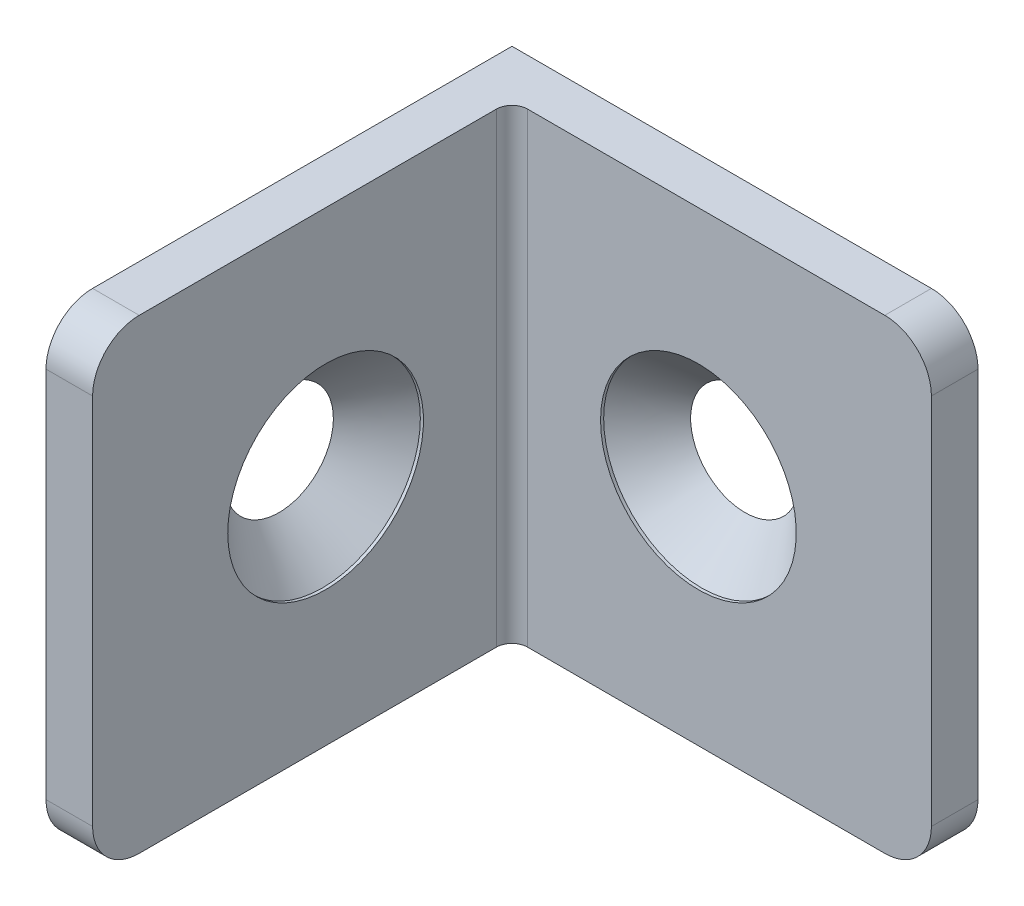
ISO-10303-21;
HEADER;
FILE_DESCRIPTION(('STEP AP214'),'2;1');
FILE_NAME('part.step','',(''),(''),'','','');
FILE_SCHEMA(('AUTOMOTIVE_DESIGN { 1 0 10303 214 1 1 1 1 }'));
ENDSEC;
DATA;
#1=APPLICATION_CONTEXT('core data for automotive mechanical design processes');
#2=APPLICATION_PROTOCOL_DEFINITION('international standard','automotive_design',2000,#1);
#3=PRODUCT_CONTEXT('',#1,'mechanical');
#4=PRODUCT('Part','Part','',(#3));
#5=PRODUCT_RELATED_PRODUCT_CATEGORY('part','',(#4));
#6=PRODUCT_DEFINITION_FORMATION('','',#4);
#7=PRODUCT_DEFINITION_CONTEXT('part definition',#1,'design');
#8=PRODUCT_DEFINITION('design','',#6,#7);
#9=PRODUCT_DEFINITION_SHAPE('','',#8);
#10=(LENGTH_UNIT() NAMED_UNIT(*) SI_UNIT(.MILLI.,.METRE.));
#11=(NAMED_UNIT(*) PLANE_ANGLE_UNIT() SI_UNIT($,.RADIAN.));
#12=(NAMED_UNIT(*) SI_UNIT($,.STERADIAN.) SOLID_ANGLE_UNIT());
#13=UNCERTAINTY_MEASURE_WITH_UNIT(LENGTH_MEASURE(1.E-05),#10,'distance_accuracy_value','');
#14=(GEOMETRIC_REPRESENTATION_CONTEXT(3) GLOBAL_UNCERTAINTY_ASSIGNED_CONTEXT((#13)) GLOBAL_UNIT_ASSIGNED_CONTEXT((#10,
#11,#12)) REPRESENTATION_CONTEXT('',''));
#15=CARTESIAN_POINT('',(0.,0.,0.));
#16=DIRECTION('',(0.,0.,1.));
#17=DIRECTION('',(1.,0.,0.));
#18=AXIS2_PLACEMENT_3D('',#15,#16,#17);
#19=CARTESIAN_POINT('',(0.,0.,2.9));
#20=DIRECTION('',(0.,0.,-1.));
#21=DIRECTION('',(-1.,0.,0.));
#22=AXIS2_PLACEMENT_3D('',#19,#20,#21);
#23=CYLINDRICAL_SURFACE('',#22,6.3);
#24=CARTESIAN_POINT('',(0.,0.,3.));
#25=DIRECTION('',(0.,0.,-1.));
#26=DIRECTION('',(-1.,0.,0.));
#27=AXIS2_PLACEMENT_3D('',#24,#25,#26);
#28=CIRCLE('',#27,6.3);
#29=CARTESIAN_POINT('',(-6.3,0.,3.));
#30=VERTEX_POINT('',#29);
#31=EDGE_CURVE('E140',#30,#30,#28,.T.);
#32=ORIENTED_EDGE('',*,*,#31,.F.);
#33=EDGE_LOOP('',(#32));
#34=FACE_BOUND('',#33,.T.);
#35=CARTESIAN_POINT('',(0.,0.,2.79999999997926));
#36=DIRECTION('',(0.,0.,1.));
#37=DIRECTION('',(1.,0.,0.));
#38=AXIS2_PLACEMENT_3D('',#35,#36,#37);
#39=CIRCLE('',#38,6.30000000006703);
#40=CARTESIAN_POINT('',(6.30000000006703,0.,2.79999999997926));
#41=VERTEX_POINT('',#40);
#42=EDGE_CURVE('E146',#41,#41,#39,.F.);
#43=ORIENTED_EDGE('',*,*,#42,.T.);
#44=EDGE_LOOP('',(#43));
#45=FACE_BOUND('',#44,.T.);
#46=ADVANCED_FACE('F16',(#34,#45),#23,.F.);
#47=CARTESIAN_POINT('',(-11.,-15.,4.));
#48=DIRECTION('',(0.,-1.,0.));
#49=DIRECTION('',(0.,0.,-1.));
#50=AXIS2_PLACEMENT_3D('',#47,#48,#49);
#51=CYLINDRICAL_SURFACE('',#50,1.);
#52=DIRECTION('',(0.,1.,0.));
#53=VECTOR('',#52,1.);
#54=CARTESIAN_POINT('',(-12.,0.,4.));
#55=LINE('',#54,#53);
#56=CARTESIAN_POINT('',(-12.,15.,4.));
#57=VERTEX_POINT('',#56);
#58=CARTESIAN_POINT('',(-12.,-15.,4.));
#59=VERTEX_POINT('',#58);
#60=EDGE_CURVE('E106',#57,#59,#55,.F.);
#61=ORIENTED_EDGE('',*,*,#60,.T.);
#62=CARTESIAN_POINT('',(-11.,-15.,4.));
#63=DIRECTION('',(0.,-1.,0.));
#64=DIRECTION('',(0.,0.,-1.));
#65=AXIS2_PLACEMENT_3D('',#62,#63,#64);
#66=CIRCLE('',#65,1.);
#67=CARTESIAN_POINT('',(-11.,-15.,3.));
#68=VERTEX_POINT('',#67);
#69=EDGE_CURVE('E19',#68,#59,#66,.F.);
#70=ORIENTED_EDGE('',*,*,#69,.F.);
#71=DIRECTION('',(0.,1.,0.));
#72=VECTOR('',#71,1.);
#73=CARTESIAN_POINT('',(-11.,0.,3.));
#74=LINE('',#73,#72);
#75=CARTESIAN_POINT('',(-11.,15.,3.));
#76=VERTEX_POINT('',#75);
#77=EDGE_CURVE('E139',#76,#68,#74,.F.);
#78=ORIENTED_EDGE('',*,*,#77,.F.);
#79=CARTESIAN_POINT('',(-11.,15.,4.));
#80=DIRECTION('',(0.,-1.,0.));
#81=DIRECTION('',(0.,0.,-1.));
#82=AXIS2_PLACEMENT_3D('',#79,#80,#81);
#83=CIRCLE('',#82,1.);
#84=EDGE_CURVE('E104',#57,#76,#83,.T.);
#85=ORIENTED_EDGE('',*,*,#84,.F.);
#86=EDGE_LOOP('',(#61,#70,#78,#85));
#87=FACE_BOUND('',#86,.T.);
#88=ADVANCED_FACE('F107',(#87),#51,.F.);
#89=CARTESIAN_POINT('',(-12.1,0.,15.));
#90=DIRECTION('',(-1.,0.,0.));
#91=DIRECTION('',(0.,0.,1.));
#92=AXIS2_PLACEMENT_3D('',#89,#90,#91);
#93=CYLINDRICAL_SURFACE('',#92,6.3);
#94=CARTESIAN_POINT('',(-12.,0.,15.));
#95=DIRECTION('',(-1.,0.,0.));
#96=DIRECTION('',(0.,0.,1.));
#97=AXIS2_PLACEMENT_3D('',#94,#95,#96);
#98=CIRCLE('',#97,6.3);
#99=CARTESIAN_POINT('',(-12.,0.,21.3));
#100=VERTEX_POINT('',#99);
#101=EDGE_CURVE('E112',#100,#100,#98,.F.);
#102=ORIENTED_EDGE('',*,*,#101,.T.);
#103=EDGE_LOOP('',(#102));
#104=FACE_BOUND('',#103,.T.);
#105=CARTESIAN_POINT('',(-12.1999999999503,0.,15.));
#106=DIRECTION('',(1.,0.,0.));
#107=DIRECTION('',(0.,0.,-1.));
#108=AXIS2_PLACEMENT_3D('',#105,#106,#107);
#109=CIRCLE('',#108,6.30000000002383);
#110=CARTESIAN_POINT('',(-12.1999999999503,0.,8.69999999997617));
#111=VERTEX_POINT('',#110);
#112=EDGE_CURVE('E111',#111,#111,#109,.F.);
#113=ORIENTED_EDGE('',*,*,#112,.T.);
#114=EDGE_LOOP('',(#113));
#115=FACE_BOUND('',#114,.T.);
#116=ADVANCED_FACE('F359',(#104,#115),#93,.F.);
#117=CARTESIAN_POINT('',(0.,0.,2.79999999997926));
#118=DIRECTION('',(0.,0.,1.));
#119=DIRECTION('',(1.,0.,0.));
#120=AXIS2_PLACEMENT_3D('',#117,#118,#119);
#121=CONICAL_SURFACE('',#120,6.30000000006703,0.785398163407599);
#122=ORIENTED_EDGE('',*,*,#42,.F.);
#123=EDGE_LOOP('',(#122));
#124=FACE_BOUND('',#123,.T.);
#125=CARTESIAN_POINT('',(0.,0.,0.));
#126=DIRECTION('',(0.,0.,1.));
#127=DIRECTION('',(1.,0.,0.));
#128=AXIS2_PLACEMENT_3D('',#125,#126,#127);
#129=CIRCLE('',#128,3.50000000003092);
#130=CARTESIAN_POINT('',(3.50000000003092,0.,0.));
#131=VERTEX_POINT('',#130);
#132=EDGE_CURVE('E121',#131,#131,#129,.F.);
#133=ORIENTED_EDGE('',*,*,#132,.T.);
#134=EDGE_LOOP('',(#133));
#135=FACE_BOUND('',#134,.T.);
#136=ADVANCED_FACE('F349',(#124,#135),#121,.F.);
#137=CARTESIAN_POINT('',(12.,-12.,3.));
#138=DIRECTION('',(0.,0.,1.));
#139=DIRECTION('',(1.,0.,0.));
#140=AXIS2_PLACEMENT_3D('',#137,#138,#139);
#141=CYLINDRICAL_SURFACE('',#140,3.);
#142=CARTESIAN_POINT('',(12.,-12.,3.));
#143=DIRECTION('',(0.,0.,1.));
#144=DIRECTION('',(1.,0.,0.));
#145=AXIS2_PLACEMENT_3D('',#142,#143,#144);
#146=CIRCLE('',#145,3.);
#147=CARTESIAN_POINT('',(12.,-15.,3.));
#148=VERTEX_POINT('',#147);
#149=CARTESIAN_POINT('',(15.,-12.,3.));
#150=VERTEX_POINT('',#149);
#151=EDGE_CURVE('E133',#148,#150,#146,.T.);
#152=ORIENTED_EDGE('',*,*,#151,.F.);
#153=DIRECTION('',(0.,0.,1.));
#154=VECTOR('',#153,1.);
#155=CARTESIAN_POINT('',(12.,-15.,15.));
#156=LINE('',#155,#154);
#157=CARTESIAN_POINT('',(12.,-15.,0.));
#158=VERTEX_POINT('',#157);
#159=EDGE_CURVE('E119',#148,#158,#156,.F.);
#160=ORIENTED_EDGE('',*,*,#159,.T.);
#161=CARTESIAN_POINT('',(12.,-12.,0.));
#162=DIRECTION('',(0.,0.,1.));
#163=DIRECTION('',(1.,0.,0.));
#164=AXIS2_PLACEMENT_3D('',#161,#162,#163);
#165=CIRCLE('',#164,3.);
#166=CARTESIAN_POINT('',(15.,-12.,0.));
#167=VERTEX_POINT('',#166);
#168=EDGE_CURVE('E168',#158,#167,#165,.T.);
#169=ORIENTED_EDGE('',*,*,#168,.T.);
#170=DIRECTION('',(0.,0.,1.));
#171=VECTOR('',#170,1.);
#172=CARTESIAN_POINT('',(15.,-12.,1.5));
#173=LINE('',#172,#171);
#174=EDGE_CURVE('E144',#167,#150,#173,.T.);
#175=ORIENTED_EDGE('',*,*,#174,.T.);
#176=EDGE_LOOP('',(#152,#160,#169,#175));
#177=FACE_BOUND('',#176,.T.);
#178=ADVANCED_FACE('F339',(#177),#141,.T.);
#179=CARTESIAN_POINT('',(15.,0.,1.5));
#180=DIRECTION('',(-1.,0.,0.));
#181=DIRECTION('',(0.,0.,1.));
#182=AXIS2_PLACEMENT_3D('',#179,#180,#181);
#183=PLANE('',#182);
#184=DIRECTION('',(0.,1.,0.));
#185=VECTOR('',#184,1.);
#186=CARTESIAN_POINT('',(15.,0.,3.));
#187=LINE('',#186,#185);
#188=CARTESIAN_POINT('',(15.,12.,3.));
#189=VERTEX_POINT('',#188);
#190=EDGE_CURVE('E130',#150,#189,#187,.T.);
#191=ORIENTED_EDGE('',*,*,#190,.F.);
#192=ORIENTED_EDGE('',*,*,#174,.F.);
#193=DIRECTION('',(0.,1.,0.));
#194=VECTOR('',#193,1.);
#195=CARTESIAN_POINT('',(15.,0.,0.));
#196=LINE('',#195,#194);
#197=CARTESIAN_POINT('',(15.,12.,0.));
#198=VERTEX_POINT('',#197);
#199=EDGE_CURVE('E167',#167,#198,#196,.T.);
#200=ORIENTED_EDGE('',*,*,#199,.T.);
#201=DIRECTION('',(0.,0.,-1.));
#202=VECTOR('',#201,1.);
#203=CARTESIAN_POINT('',(15.,12.,0.));
#204=LINE('',#203,#202);
#205=EDGE_CURVE('E142',#189,#198,#204,.T.);
#206=ORIENTED_EDGE('',*,*,#205,.F.);
#207=EDGE_LOOP('',(#191,#192,#200,#206));
#208=FACE_BOUND('',#207,.T.);
#209=ADVANCED_FACE('F329',(#208),#183,.F.);
#210=CARTESIAN_POINT('',(12.,12.,0.));
#211=DIRECTION('',(0.,0.,-1.));
#212=DIRECTION('',(-1.,0.,0.));
#213=AXIS2_PLACEMENT_3D('',#210,#211,#212);
#214=CYLINDRICAL_SURFACE('',#213,3.);
#215=CARTESIAN_POINT('',(12.,12.,0.));
#216=DIRECTION('',(0.,0.,-1.));
#217=DIRECTION('',(-1.,0.,0.));
#218=AXIS2_PLACEMENT_3D('',#215,#216,#217);
#219=CIRCLE('',#218,3.);
#220=CARTESIAN_POINT('',(12.,15.,0.));
#221=VERTEX_POINT('',#220);
#222=EDGE_CURVE('E164',#198,#221,#219,.F.);
#223=ORIENTED_EDGE('',*,*,#222,.T.);
#224=DIRECTION('',(0.,0.,-1.));
#225=VECTOR('',#224,1.);
#226=CARTESIAN_POINT('',(12.,15.,15.));
#227=LINE('',#226,#225);
#228=CARTESIAN_POINT('',(12.,15.,3.));
#229=VERTEX_POINT('',#228);
#230=EDGE_CURVE('E134',#221,#229,#227,.F.);
#231=ORIENTED_EDGE('',*,*,#230,.T.);
#232=CARTESIAN_POINT('',(12.,12.,3.));
#233=DIRECTION('',(0.,0.,-1.));
#234=DIRECTION('',(-1.,0.,0.));
#235=AXIS2_PLACEMENT_3D('',#232,#233,#234);
#236=CIRCLE('',#235,3.);
#237=EDGE_CURVE('E132',#189,#229,#236,.F.);
#238=ORIENTED_EDGE('',*,*,#237,.F.);
#239=ORIENTED_EDGE('',*,*,#205,.T.);
#240=EDGE_LOOP('',(#223,#231,#238,#239));
#241=FACE_BOUND('',#240,.T.);
#242=ADVANCED_FACE('F320',(#241),#214,.T.);
#243=CARTESIAN_POINT('',(0.,0.,3.));
#244=DIRECTION('',(0.,0.,1.));
#245=DIRECTION('',(1.,0.,0.));
#246=AXIS2_PLACEMENT_3D('',#243,#244,#245);
#247=PLANE('',#246);
#248=ORIENTED_EDGE('',*,*,#237,.T.);
#249=DIRECTION('',(1.,0.,0.));
#250=VECTOR('',#249,1.);
#251=CARTESIAN_POINT('',(-13.5,15.,3.));
#252=LINE('',#251,#250);
#253=EDGE_CURVE('E137',#229,#76,#252,.F.);
#254=ORIENTED_EDGE('',*,*,#253,.T.);
#255=ORIENTED_EDGE('',*,*,#77,.T.);
#256=DIRECTION('',(1.,0.,0.));
#257=VECTOR('',#256,1.);
#258=CARTESIAN_POINT('',(-13.5,-15.,3.));
#259=LINE('',#258,#257);
#260=EDGE_CURVE('E103',#68,#148,#259,.T.);
#261=ORIENTED_EDGE('',*,*,#260,.T.);
#262=ORIENTED_EDGE('',*,*,#151,.T.);
#263=ORIENTED_EDGE('',*,*,#190,.T.);
#264=EDGE_LOOP('',(#248,#254,#255,#261,#262,#263));
#265=FACE_BOUND('',#264,.T.);
#266=ORIENTED_EDGE('',*,*,#31,.T.);
#267=EDGE_LOOP('',(#266));
#268=FACE_BOUND('',#267,.T.);
#269=ADVANCED_FACE('F186',(#265,#268),#247,.T.);
#270=CARTESIAN_POINT('',(-12.,0.,15.));
#271=DIRECTION('',(-1.,0.,0.));
#272=DIRECTION('',(0.,0.,1.));
#273=AXIS2_PLACEMENT_3D('',#270,#271,#272);
#274=PLANE('',#273);
#275=DIRECTION('',(0.,0.,-1.));
#276=VECTOR('',#275,1.);
#277=CARTESIAN_POINT('',(-12.,15.,15.));
#278=LINE('',#277,#276);
#279=CARTESIAN_POINT('',(-12.,15.,27.));
#280=VERTEX_POINT('',#279);
#281=EDGE_CURVE('E166',#57,#280,#278,.F.);
#282=ORIENTED_EDGE('',*,*,#281,.T.);
#283=CARTESIAN_POINT('',(-12.,12.,27.));
#284=DIRECTION('',(-1.,0.,0.));
#285=DIRECTION('',(0.,0.,1.));
#286=AXIS2_PLACEMENT_3D('',#283,#284,#285);
#287=CIRCLE('',#286,3.);
#288=CARTESIAN_POINT('',(-12.,12.,30.));
#289=VERTEX_POINT('',#288);
#290=EDGE_CURVE('E162',#289,#280,#287,.T.);
#291=ORIENTED_EDGE('',*,*,#290,.F.);
#292=DIRECTION('',(0.,1.,0.));
#293=VECTOR('',#292,1.);
#294=CARTESIAN_POINT('',(-12.,0.,30.));
#295=LINE('',#294,#293);
#296=CARTESIAN_POINT('',(-12.,-12.,30.));
#297=VERTEX_POINT('',#296);
#298=EDGE_CURVE('E126',#297,#289,#295,.T.);
#299=ORIENTED_EDGE('',*,*,#298,.F.);
#300=CARTESIAN_POINT('',(-12.,-12.,27.));
#301=DIRECTION('',(1.,0.,0.));
#302=DIRECTION('',(0.,0.,-1.));
#303=AXIS2_PLACEMENT_3D('',#300,#301,#302);
#304=CIRCLE('',#303,3.);
#305=CARTESIAN_POINT('',(-12.,-15.,27.));
#306=VERTEX_POINT('',#305);
#307=EDGE_CURVE('E118',#306,#297,#304,.F.);
#308=ORIENTED_EDGE('',*,*,#307,.F.);
#309=DIRECTION('',(0.,0.,1.));
#310=VECTOR('',#309,1.);
#311=CARTESIAN_POINT('',(-12.,-15.,15.));
#312=LINE('',#311,#310);
#313=EDGE_CURVE('E100',#306,#59,#312,.F.);
#314=ORIENTED_EDGE('',*,*,#313,.T.);
#315=ORIENTED_EDGE('',*,*,#60,.F.);
#316=EDGE_LOOP('',(#282,#291,#299,#308,#314,#315));
#317=FACE_BOUND('',#316,.T.);
#318=ORIENTED_EDGE('',*,*,#101,.F.);
#319=EDGE_LOOP('',(#318));
#320=FACE_BOUND('',#319,.T.);
#321=ADVANCED_FACE('F115',(#317,#320),#274,.F.);
#322=CARTESIAN_POINT('',(-12.2000000000071,0.,15.));
#323=DIRECTION('',(1.,0.,0.));
#324=DIRECTION('',(0.,1.,0.));
#325=AXIS2_PLACEMENT_3D('',#322,#323,#324);
#326=CONICAL_SURFACE('',#325,6.29999999991014,0.785398163387298);
#327=ORIENTED_EDGE('',*,*,#112,.F.);
#328=EDGE_LOOP('',(#327));
#329=FACE_BOUND('',#328,.T.);
#330=CARTESIAN_POINT('',(-15.0000000000432,0.,15.));
#331=DIRECTION('',(1.,0.,0.));
#332=DIRECTION('',(0.,1.,0.));
#333=AXIS2_PLACEMENT_3D('',#330,#331,#332);
#334=CIRCLE('',#333,3.49999999993088);
#335=CARTESIAN_POINT('',(-15.0000000000432,3.49999999993088,15.));
#336=VERTEX_POINT('',#335);
#337=EDGE_CURVE('E156',#336,#336,#334,.F.);
#338=ORIENTED_EDGE('',*,*,#337,.T.);
#339=EDGE_LOOP('',(#338));
#340=FACE_BOUND('',#339,.T.);
#341=ADVANCED_FACE('F294',(#329,#340),#326,.F.);
#342=CARTESIAN_POINT('',(-13.5,-15.,15.));
#343=DIRECTION('',(0.,1.,0.));
#344=DIRECTION('',(0.,0.,1.));
#345=AXIS2_PLACEMENT_3D('',#342,#343,#344);
#346=PLANE('',#345);
#347=ORIENTED_EDGE('',*,*,#69,.T.);
#348=ORIENTED_EDGE('',*,*,#313,.F.);
#349=DIRECTION('',(1.,0.,0.));
#350=VECTOR('',#349,1.);
#351=CARTESIAN_POINT('',(-12.,-15.,27.));
#352=LINE('',#351,#350);
#353=CARTESIAN_POINT('',(-15.,-15.,27.));
#354=VERTEX_POINT('',#353);
#355=EDGE_CURVE('E161',#354,#306,#352,.T.);
#356=ORIENTED_EDGE('',*,*,#355,.F.);
#357=DIRECTION('',(0.,0.,-1.));
#358=VECTOR('',#357,1.);
#359=CARTESIAN_POINT('',(-15.,-15.,15.));
#360=LINE('',#359,#358);
#361=CARTESIAN_POINT('',(-15.,-15.,0.));
#362=VERTEX_POINT('',#361);
#363=EDGE_CURVE('E159',#354,#362,#360,.T.);
#364=ORIENTED_EDGE('',*,*,#363,.T.);
#365=DIRECTION('',(1.,0.,0.));
#366=VECTOR('',#365,1.);
#367=CARTESIAN_POINT('',(-13.5,-15.,0.));
#368=LINE('',#367,#366);
#369=EDGE_CURVE('E171',#362,#158,#368,.T.);
#370=ORIENTED_EDGE('',*,*,#369,.T.);
#371=ORIENTED_EDGE('',*,*,#159,.F.);
#372=ORIENTED_EDGE('',*,*,#260,.F.);
#373=EDGE_LOOP('',(#347,#348,#356,#364,#370,#371,#372));
#374=FACE_BOUND('',#373,.T.);
#375=ADVANCED_FACE('F97',(#374),#346,.F.);
#376=CARTESIAN_POINT('',(-13.5,0.,0.));
#377=DIRECTION('',(0.,0.,1.));
#378=DIRECTION('',(1.,0.,0.));
#379=AXIS2_PLACEMENT_3D('',#376,#377,#378);
#380=PLANE('',#379);
#381=ORIENTED_EDGE('',*,*,#199,.F.);
#382=ORIENTED_EDGE('',*,*,#168,.F.);
#383=ORIENTED_EDGE('',*,*,#369,.F.);
#384=DIRECTION('',(0.,1.,0.));
#385=VECTOR('',#384,1.);
#386=CARTESIAN_POINT('',(-15.,0.,0.));
#387=LINE('',#386,#385);
#388=CARTESIAN_POINT('',(-15.,15.,0.));
#389=VERTEX_POINT('',#388);
#390=EDGE_CURVE('E198',#362,#389,#387,.T.);
#391=ORIENTED_EDGE('',*,*,#390,.T.);
#392=DIRECTION('',(1.,0.,0.));
#393=VECTOR('',#392,1.);
#394=CARTESIAN_POINT('',(-13.5,15.,0.));
#395=LINE('',#394,#393);
#396=EDGE_CURVE('E138',#389,#221,#395,.T.);
#397=ORIENTED_EDGE('',*,*,#396,.T.);
#398=ORIENTED_EDGE('',*,*,#222,.F.);
#399=EDGE_LOOP('',(#381,#382,#383,#391,#397,#398));
#400=FACE_BOUND('',#399,.T.);
#401=ORIENTED_EDGE('',*,*,#132,.F.);
#402=EDGE_LOOP('',(#401));
#403=FACE_BOUND('',#402,.T.);
#404=ADVANCED_FACE('F214',(#400,#403),#380,.F.);
#405=CARTESIAN_POINT('',(-13.5,15.,15.));
#406=DIRECTION('',(0.,-1.,0.));
#407=DIRECTION('',(0.,0.,-1.));
#408=AXIS2_PLACEMENT_3D('',#405,#406,#407);
#409=PLANE('',#408);
#410=ORIENTED_EDGE('',*,*,#253,.F.);
#411=ORIENTED_EDGE('',*,*,#230,.F.);
#412=ORIENTED_EDGE('',*,*,#396,.F.);
#413=DIRECTION('',(0.,0.,-1.));
#414=VECTOR('',#413,1.);
#415=CARTESIAN_POINT('',(-15.,15.,15.));
#416=LINE('',#415,#414);
#417=CARTESIAN_POINT('',(-15.,15.,27.));
#418=VERTEX_POINT('',#417);
#419=EDGE_CURVE('E155',#389,#418,#416,.F.);
#420=ORIENTED_EDGE('',*,*,#419,.T.);
#421=DIRECTION('',(-1.,0.,0.));
#422=VECTOR('',#421,1.);
#423=CARTESIAN_POINT('',(-15.,15.,27.));
#424=LINE('',#423,#422);
#425=EDGE_CURVE('E129',#280,#418,#424,.T.);
#426=ORIENTED_EDGE('',*,*,#425,.F.);
#427=ORIENTED_EDGE('',*,*,#281,.F.);
#428=ORIENTED_EDGE('',*,*,#84,.T.);
#429=EDGE_LOOP('',(#410,#411,#412,#420,#426,#427,#428));
#430=FACE_BOUND('',#429,.T.);
#431=ADVANCED_FACE('F181',(#430),#409,.F.);
#432=CARTESIAN_POINT('',(-15.,12.,27.));
#433=DIRECTION('',(-1.,0.,0.));
#434=DIRECTION('',(0.,0.,1.));
#435=AXIS2_PLACEMENT_3D('',#432,#433,#434);
#436=CYLINDRICAL_SURFACE('',#435,3.);
#437=CARTESIAN_POINT('',(-15.,12.,27.));
#438=DIRECTION('',(-1.,0.,0.));
#439=DIRECTION('',(0.,0.,1.));
#440=AXIS2_PLACEMENT_3D('',#437,#438,#439);
#441=CIRCLE('',#440,3.);
#442=CARTESIAN_POINT('',(-15.,12.,30.));
#443=VERTEX_POINT('',#442);
#444=EDGE_CURVE('E152',#418,#443,#441,.F.);
#445=ORIENTED_EDGE('',*,*,#444,.T.);
#446=DIRECTION('',(1.,0.,0.));
#447=VECTOR('',#446,1.);
#448=CARTESIAN_POINT('',(-13.5,12.,30.));
#449=LINE('',#448,#447);
#450=EDGE_CURVE('E128',#289,#443,#449,.F.);
#451=ORIENTED_EDGE('',*,*,#450,.F.);
#452=ORIENTED_EDGE('',*,*,#290,.T.);
#453=ORIENTED_EDGE('',*,*,#425,.T.);
#454=EDGE_LOOP('',(#445,#451,#452,#453));
#455=FACE_BOUND('',#454,.T.);
#456=ADVANCED_FACE('F239',(#455),#436,.T.);
#457=CARTESIAN_POINT('',(-13.5,0.,30.));
#458=DIRECTION('',(0.,0.,1.));
#459=DIRECTION('',(1.,0.,0.));
#460=AXIS2_PLACEMENT_3D('',#457,#458,#459);
#461=PLANE('',#460);
#462=ORIENTED_EDGE('',*,*,#450,.T.);
#463=DIRECTION('',(0.,1.,0.));
#464=VECTOR('',#463,1.);
#465=CARTESIAN_POINT('',(-15.,0.,30.));
#466=LINE('',#465,#464);
#467=CARTESIAN_POINT('',(-15.,-12.,30.));
#468=VERTEX_POINT('',#467);
#469=EDGE_CURVE('E25',#443,#468,#466,.F.);
#470=ORIENTED_EDGE('',*,*,#469,.T.);
#471=DIRECTION('',(1.,0.,0.));
#472=VECTOR('',#471,1.);
#473=CARTESIAN_POINT('',(-12.,-12.,30.));
#474=LINE('',#473,#472);
#475=EDGE_CURVE('E33',#297,#468,#474,.F.);
#476=ORIENTED_EDGE('',*,*,#475,.F.);
#477=ORIENTED_EDGE('',*,*,#298,.T.);
#478=EDGE_LOOP('',(#462,#470,#476,#477));
#479=FACE_BOUND('',#478,.T.);
#480=ADVANCED_FACE('F236',(#479),#461,.T.);
#481=CARTESIAN_POINT('',(-12.,-12.,27.));
#482=DIRECTION('',(1.,0.,0.));
#483=DIRECTION('',(0.,0.,-1.));
#484=AXIS2_PLACEMENT_3D('',#481,#482,#483);
#485=CYLINDRICAL_SURFACE('',#484,3.);
#486=ORIENTED_EDGE('',*,*,#307,.T.);
#487=ORIENTED_EDGE('',*,*,#475,.T.);
#488=CARTESIAN_POINT('',(-15.,-12.,27.));
#489=DIRECTION('',(1.,0.,0.));
#490=DIRECTION('',(0.,0.,-1.));
#491=AXIS2_PLACEMENT_3D('',#488,#489,#490);
#492=CIRCLE('',#491,3.);
#493=EDGE_CURVE('E10',#468,#354,#492,.T.);
#494=ORIENTED_EDGE('',*,*,#493,.T.);
#495=ORIENTED_EDGE('',*,*,#355,.T.);
#496=EDGE_LOOP('',(#486,#487,#494,#495));
#497=FACE_BOUND('',#496,.T.);
#498=ADVANCED_FACE('F247',(#497),#485,.T.);
#499=CARTESIAN_POINT('',(-15.,0.,15.));
#500=DIRECTION('',(1.,0.,0.));
#501=DIRECTION('',(0.,0.,-1.));
#502=AXIS2_PLACEMENT_3D('',#499,#500,#501);
#503=PLANE('',#502);
#504=ORIENTED_EDGE('',*,*,#469,.F.);
#505=ORIENTED_EDGE('',*,*,#444,.F.);
#506=ORIENTED_EDGE('',*,*,#419,.F.);
#507=ORIENTED_EDGE('',*,*,#390,.F.);
#508=ORIENTED_EDGE('',*,*,#363,.F.);
#509=ORIENTED_EDGE('',*,*,#493,.F.);
#510=EDGE_LOOP('',(#504,#505,#506,#507,#508,#509));
#511=FACE_BOUND('',#510,.T.);
#512=ORIENTED_EDGE('',*,*,#337,.F.);
#513=EDGE_LOOP('',(#512));
#514=FACE_BOUND('',#513,.T.);
#515=ADVANCED_FACE('F219',(#511,#514),#503,.F.);
#516=CLOSED_SHELL('',(#46,#88,#116,#136,#178,#209,#242,#269,#321,#341,#375,#404,#431,#456,#480,
#498,#515));
#517=MANIFOLD_SOLID_BREP('B1',#516);
#518=ADVANCED_BREP_SHAPE_REPRESENTATION('',(#18,#517),#14);
#519=SHAPE_DEFINITION_REPRESENTATION(#9,#518);
ENDSEC;
END-ISO-10303-21;
